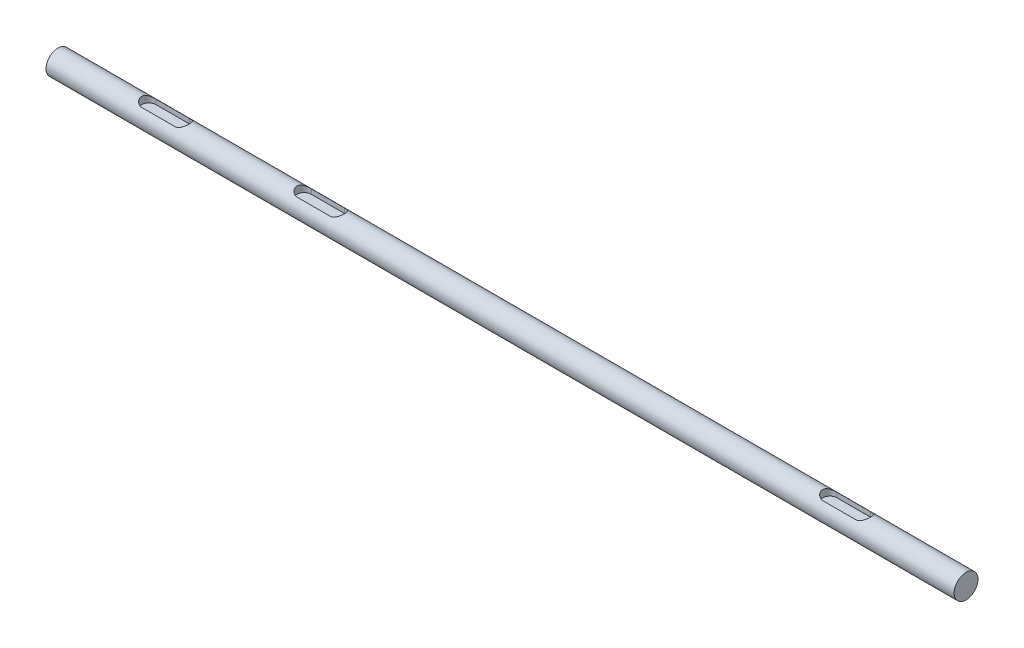
ISO-10303-21;
HEADER;
FILE_DESCRIPTION(('STEP AP214'),'2;1');
FILE_NAME('part.step','',(''),(''),'','','');
FILE_SCHEMA(('AUTOMOTIVE_DESIGN { 1 0 10303 214 1 1 1 1 }'));
ENDSEC;
DATA;
#1=APPLICATION_CONTEXT('core data for automotive mechanical design processes');
#2=APPLICATION_PROTOCOL_DEFINITION('international standard','automotive_design',2000,#1);
#3=PRODUCT_CONTEXT('',#1,'mechanical');
#4=PRODUCT('Part','Part','',(#3));
#5=PRODUCT_RELATED_PRODUCT_CATEGORY('part','',(#4));
#6=PRODUCT_DEFINITION_FORMATION('','',#4);
#7=PRODUCT_DEFINITION_CONTEXT('part definition',#1,'design');
#8=PRODUCT_DEFINITION('design','',#6,#7);
#9=PRODUCT_DEFINITION_SHAPE('','',#8);
#10=(LENGTH_UNIT() NAMED_UNIT(*) SI_UNIT(.MILLI.,.METRE.));
#11=(NAMED_UNIT(*) PLANE_ANGLE_UNIT() SI_UNIT($,.RADIAN.));
#12=(NAMED_UNIT(*) SI_UNIT($,.STERADIAN.) SOLID_ANGLE_UNIT());
#13=UNCERTAINTY_MEASURE_WITH_UNIT(LENGTH_MEASURE(1.E-05),#10,'distance_accuracy_value','');
#14=(GEOMETRIC_REPRESENTATION_CONTEXT(3) GLOBAL_UNCERTAINTY_ASSIGNED_CONTEXT((#13)) GLOBAL_UNIT_ASSIGNED_CONTEXT((#10,
#11,#12)) REPRESENTATION_CONTEXT('',''));
#15=CARTESIAN_POINT('',(0.,0.,0.));
#16=DIRECTION('',(0.,0.,1.));
#17=DIRECTION('',(1.,0.,0.));
#18=AXIS2_PLACEMENT_3D('',#15,#16,#17);
#19=CARTESIAN_POINT('',(150.,0.,0.));
#20=DIRECTION('',(-1.,0.,0.));
#21=DIRECTION('',(0.,0.,1.));
#22=AXIS2_PLACEMENT_3D('',#19,#20,#21);
#23=CYLINDRICAL_SURFACE('',#22,5.);
#24=DIRECTION('',(-1.,0.,0.));
#25=VECTOR('',#24,1.);
#26=CARTESIAN_POINT('',(150.,4.,-3.));
#27=LINE('',#26,#25);
#28=CARTESIAN_POINT('',(-42.,4.,-3.));
#29=VERTEX_POINT('',#28);
#30=CARTESIAN_POINT('',(-28.,4.,-3.));
#31=VERTEX_POINT('',#30);
#32=EDGE_CURVE('E11',#29,#31,#27,.F.);
#33=ORIENTED_EDGE('',*,*,#32,.T.);
#34=CARTESIAN_POINT('',(-28.,4.,-3.));
#35=CARTESIAN_POINT('',(-27.9241280221834,3.99996787232582,-3.00001692537307));
#36=CARTESIAN_POINT('',(-27.8482749220991,4.00215786299425,-2.99712241547426));
#37=CARTESIAN_POINT('',(-27.6973112239566,4.01073748214673,-2.98564518053647));
#38=CARTESIAN_POINT('',(-27.6221999744858,4.01712301686455,-2.97706800024636));
#39=CARTESIAN_POINT('',(-27.4738703308118,4.03378307190143,-2.95445046977405));
#40=CARTESIAN_POINT('',(-27.4006415989821,4.04402606066036,-2.94045438932729));
#41=CARTESIAN_POINT('',(-27.2559715272574,4.06798283405873,-2.90722136348392));
#42=CARTESIAN_POINT('',(-27.1845305495832,4.0816973159079,-2.88798336524856));
#43=CARTESIAN_POINT('',(-26.9740702999556,4.12720949885208,-2.8229314582683));
#44=CARTESIAN_POINT('',(-26.8382388208228,4.16345930010658,-2.76967363516867));
#45=CARTESIAN_POINT('',(-26.5773474913312,4.24363256758645,-2.64519536397733));
#46=CARTESIAN_POINT('',(-26.452312966274,4.28757338079438,-2.57393414481207));
#47=CARTESIAN_POINT('',(-26.2000829262627,4.38458187114305,-2.40540739276781));
#48=CARTESIAN_POINT('',(-26.0744671609752,4.43810998768876,-2.30603538494307));
#49=CARTESIAN_POINT('',(-25.8404290288709,4.54454402644166,-2.08849836637956));
#50=CARTESIAN_POINT('',(-25.7320128445211,4.59744971861748,-1.97032662842432));
#51=CARTESIAN_POINT('',(-25.5237215220427,4.70351635584217,-1.70284992270617));
#52=CARTESIAN_POINT('',(-25.4260392778907,4.75608571502877,-1.55155989155464));
#53=CARTESIAN_POINT('',(-25.3002589397949,4.82570253754456,-1.31133584893003));
#54=CARTESIAN_POINT('',(-25.2617799908048,4.84737427703644,-1.22901675253547));
#55=CARTESIAN_POINT('',(-25.1922108027474,4.88700901757081,-1.06047705712917));
#56=CARTESIAN_POINT('',(-25.1611156760923,4.90497447088308,-0.974259084161877));
#57=CARTESIAN_POINT('',(-25.1093725588663,4.93511192382809,-0.806968111144919));
#58=CARTESIAN_POINT('',(-25.0880127734137,4.94767213737429,-0.726184333286254));
#59=CARTESIAN_POINT('',(-25.0520501099069,4.96892319630847,-0.562666702523369));
#60=CARTESIAN_POINT('',(-25.0374434665847,4.97761619778881,-0.479933963388205));
#61=CARTESIAN_POINT('',(-25.0152153598201,4.99087752212245,-0.313245067395159));
#62=CARTESIAN_POINT('',(-25.0075901838673,4.99544803715671,-0.229289584910363));
#63=CARTESIAN_POINT('',(-24.9994333600349,5.00033941568446,-0.0609399693770666));
#64=CARTESIAN_POINT('',(-24.998900990462,5.00066071153612,0.0234541181691716));
#65=CARTESIAN_POINT('',(-25.0072428016894,4.9956526925416,0.255171482719202));
#66=CARTESIAN_POINT('',(-25.023471259101,4.98590474727508,0.402220564293304));
#67=CARTESIAN_POINT('',(-25.0769555993607,4.95416382666838,0.690956802634009));
#68=CARTESIAN_POINT('',(-25.1142129542032,4.93216999413411,0.832643583305875));
#69=CARTESIAN_POINT('',(-25.208333074643,4.87769664946882,1.10810810538678));
#70=CARTESIAN_POINT('',(-25.26530867548,4.8451568590039,1.24183502003439));
#71=CARTESIAN_POINT('',(-25.3967704462755,4.77219201218866,1.49798262201563));
#72=CARTESIAN_POINT('',(-25.4712606642976,4.73176513330436,1.62040068646819));
#73=CARTESIAN_POINT('',(-25.6456691473636,4.64076401053392,1.86613229963392));
#74=CARTESIAN_POINT('',(-25.7475609391838,4.5895545518581,1.98780984018438));
#75=CARTESIAN_POINT('',(-25.9687674333155,4.48512684863209,2.21339922400098));
#76=CARTESIAN_POINT('',(-26.0881100798147,4.43190548570084,2.31728198187349));
#77=CARTESIAN_POINT('',(-26.3574679760507,4.322164352034,2.5165997199067));
#78=CARTESIAN_POINT('',(-26.5094373284318,4.26598422797724,2.60963495464279));
#79=CARTESIAN_POINT('',(-26.7497711478056,4.1901448347924,2.72853585268935));
#80=CARTESIAN_POINT('',(-26.8318604123314,4.16628916905457,2.76470247721435));
#81=CARTESIAN_POINT('',(-26.9998112007359,4.12235655723053,2.82979053218026));
#82=CARTESIAN_POINT('',(-27.0856695628082,4.10227651585106,2.8587179039267));
#83=CARTESIAN_POINT('',(-27.2391915884192,4.07119612829703,2.90274028553152));
#84=CARTESIAN_POINT('',(-27.3061805456493,4.05917589940332,2.91948814079958));
#85=CARTESIAN_POINT('',(-27.4416068052408,4.03823334849025,2.94838741026761));
#86=CARTESIAN_POINT('',(-27.5100436221323,4.02931000501334,2.96054034014789));
#87=CARTESIAN_POINT('',(-27.6484237803627,4.0148292966003,2.9801517937935));
#88=CARTESIAN_POINT('',(-27.7183742042031,4.00929524901473,2.98757781123641));
#89=CARTESIAN_POINT('',(-27.8588785148202,4.00186666189432,2.99751072442895));
#90=CARTESIAN_POINT('',(-27.9294328988839,3.99997548544344,3.00001307471461));
#91=CARTESIAN_POINT('',(-28.,4.,3.));
#92=B_SPLINE_CURVE_WITH_KNOTS('',3,(#34,#35,#36,#37,#38,#39,#40,#41,#42,#43,#44,#45,#46,#47,#48,
#49,#50,#51,#52,#53,#54,#55,#56,#57,#58,#59,#60,#61,#62,#63,#64,#65,#66,#67,#68,#69,#70,#71,#72,
#73,#74,#75,#76,#77,#78,#79,#80,#81,#82,#83,#84,#85,#86,#87,#88,#89,#90,#91),.UNSPECIFIED.,.F.,
.F.,(4,2,2,2,2,2,2,2,2,2,2,2,2,2,2,2,2,2,2,2,2,2,2,2,2,2,2,2,4),(0.,0.227498555850963,
0.454775460929311,0.680233524310973,0.905736904347181,1.35470516337821,1.80469943008078,
2.30931246709203,2.81410648055544,3.37351129512612,3.65339988736764,3.93310269272289,
4.18623678333959,4.43922956632184,4.69208773794773,4.94492018104929,5.38737462629134,
5.82986004658815,6.27492058766907,6.7200840946005,7.21836387040733,7.71745046525489,
8.27476706024815,8.55288821458631,8.83078035880877,9.04083694509352,9.250824181618,
9.462240299649,9.67385150282051),.UNSPECIFIED.);
#93=CARTESIAN_POINT('',(-28.,4.,3.));
#94=VERTEX_POINT('',#93);
#95=EDGE_CURVE('E504',#31,#94,#92,.T.);
#96=ORIENTED_EDGE('',*,*,#95,.T.);
#97=DIRECTION('',(-1.,0.,0.));
#98=VECTOR('',#97,1.);
#99=CARTESIAN_POINT('',(150.,4.,3.));
#100=LINE('',#99,#98);
#101=CARTESIAN_POINT('',(-42.,4.,3.));
#102=VERTEX_POINT('',#101);
#103=EDGE_CURVE('E52',#94,#102,#100,.T.);
#104=ORIENTED_EDGE('',*,*,#103,.T.);
#105=CARTESIAN_POINT('',(-42.,4.,3.));
#106=CARTESIAN_POINT('',(-42.0758719778166,3.99996787232582,3.00001692537307));
#107=CARTESIAN_POINT('',(-42.1517250779009,4.00215786299425,2.99712241547426));
#108=CARTESIAN_POINT('',(-42.3026887760434,4.01073748214673,2.98564518053647));
#109=CARTESIAN_POINT('',(-42.3778000255142,4.01712301686455,2.97706800024636));
#110=CARTESIAN_POINT('',(-42.5261296691882,4.03378307190143,2.95445046977405));
#111=CARTESIAN_POINT('',(-42.5993584010179,4.04402606066036,2.9404543893273));
#112=CARTESIAN_POINT('',(-42.7440284727426,4.06798283405872,2.90722136348392));
#113=CARTESIAN_POINT('',(-42.8154694504168,4.0816973159079,2.88798336524856));
#114=CARTESIAN_POINT('',(-43.0259297000444,4.12720949885209,2.8229314582683));
#115=CARTESIAN_POINT('',(-43.1617611791772,4.16345930010658,2.76967363516867));
#116=CARTESIAN_POINT('',(-43.4226525086688,4.24363256758645,2.64519536397734));
#117=CARTESIAN_POINT('',(-43.547687033726,4.28757338079438,2.57393414481208));
#118=CARTESIAN_POINT('',(-43.7999170737373,4.38458187114305,2.40540739276781));
#119=CARTESIAN_POINT('',(-43.9255328390247,4.43810998768876,2.30603538494307));
#120=CARTESIAN_POINT('',(-44.1595709711291,4.54454402644166,2.08849836637956));
#121=CARTESIAN_POINT('',(-44.2679871554789,4.59744971861748,1.97032662842432));
#122=CARTESIAN_POINT('',(-44.4762784779573,4.70351635584217,1.70284992270617));
#123=CARTESIAN_POINT('',(-44.5739607221093,4.75608571502877,1.55155989155464));
#124=CARTESIAN_POINT('',(-44.6997410602051,4.82570253754456,1.31133584893003));
#125=CARTESIAN_POINT('',(-44.7382200091952,4.84737427703644,1.22901675253547));
#126=CARTESIAN_POINT('',(-44.8077891972526,4.88700901757081,1.06047705712918));
#127=CARTESIAN_POINT('',(-44.8388843239077,4.90497447088308,0.974259084161879));
#128=CARTESIAN_POINT('',(-44.8906274411337,4.93511192382809,0.806968111144922));
#129=CARTESIAN_POINT('',(-44.9119872265863,4.94767213737429,0.726184333286258));
#130=CARTESIAN_POINT('',(-44.9479498900931,4.96892319630847,0.562666702523372));
#131=CARTESIAN_POINT('',(-44.9625565334154,4.97761619778881,0.479933963388208));
#132=CARTESIAN_POINT('',(-44.9847846401799,4.99087752212245,0.313245067395162));
#133=CARTESIAN_POINT('',(-44.9924098161327,4.99544803715671,0.229289584910366));
#134=CARTESIAN_POINT('',(-45.0005666399651,5.00033941568446,0.0609399693770691));
#135=CARTESIAN_POINT('',(-45.001099009538,5.00066071153612,-0.0234541181691696));
#136=CARTESIAN_POINT('',(-44.9927571983106,4.99565269254161,-0.2551714827192));
#137=CARTESIAN_POINT('',(-44.976528740899,4.98590474727508,-0.402220564293303));
#138=CARTESIAN_POINT('',(-44.9230444006393,4.95416382666838,-0.690956802634007));
#139=CARTESIAN_POINT('',(-44.8857870457968,4.93216999413411,-0.832643583305873));
#140=CARTESIAN_POINT('',(-44.791666925357,4.87769664946882,-1.10810810538677));
#141=CARTESIAN_POINT('',(-44.73469132452,4.8451568590039,-1.24183502003439));
#142=CARTESIAN_POINT('',(-44.6032295537245,4.77219201218867,-1.49798262201564));
#143=CARTESIAN_POINT('',(-44.5287393357024,4.73176513330436,-1.62040068646819));
#144=CARTESIAN_POINT('',(-44.3543308526364,4.64076401053392,-1.86613229963392));
#145=CARTESIAN_POINT('',(-44.2524390608162,4.5895545518581,-1.98780984018439));
#146=CARTESIAN_POINT('',(-44.0312325666845,4.48512684863209,-2.21339922400099));
#147=CARTESIAN_POINT('',(-43.9118899201853,4.43190548570084,-2.31728198187349));
#148=CARTESIAN_POINT('',(-43.6425320239493,4.322164352034,-2.5165997199067));
#149=CARTESIAN_POINT('',(-43.4905626715682,4.26598422797724,-2.60963495464279));
#150=CARTESIAN_POINT('',(-43.2502288521944,4.1901448347924,-2.72853585268935));
#151=CARTESIAN_POINT('',(-43.1681395876686,4.16628916905457,-2.76470247721435));
#152=CARTESIAN_POINT('',(-43.0001887992641,4.12235655723053,-2.82979053218026));
#153=CARTESIAN_POINT('',(-42.9143304371918,4.10227651585106,-2.8587179039267));
#154=CARTESIAN_POINT('',(-42.7608084115808,4.07119612829703,-2.90274028553152));
#155=CARTESIAN_POINT('',(-42.6938194543507,4.05917589940332,-2.91948814079959));
#156=CARTESIAN_POINT('',(-42.5583931947592,4.03823334849025,-2.94838741026761));
#157=CARTESIAN_POINT('',(-42.4899563778677,4.02931000501334,-2.96054034014789));
#158=CARTESIAN_POINT('',(-42.3515762196373,4.0148292966003,-2.9801517937935));
#159=CARTESIAN_POINT('',(-42.2816257957969,4.00929524901473,-2.98757781123641));
#160=CARTESIAN_POINT('',(-42.1411214851798,4.00186666189432,-2.99751072442895));
#161=CARTESIAN_POINT('',(-42.0705671011161,3.99997548544344,-3.00001307471461));
#162=CARTESIAN_POINT('',(-42.,4.,-3.));
#163=B_SPLINE_CURVE_WITH_KNOTS('',3,(#105,#106,#107,#108,#109,#110,#111,#112,#113,#114,#115,
#116,#117,#118,#119,#120,#121,#122,#123,#124,#125,#126,#127,#128,#129,#130,#131,#132,#133,#134,
#135,#136,#137,#138,#139,#140,#141,#142,#143,#144,#145,#146,#147,#148,#149,#150,#151,#152,#153,
#154,#155,#156,#157,#158,#159,#160,#161,#162),.UNSPECIFIED.,.F.,.F.,(4,2,2,2,2,2,2,2,2,2,2,2,2,
2,2,2,2,2,2,2,2,2,2,2,2,2,2,2,4),(0.,0.22749855585097,0.454775460929308,0.680233524310951,
0.905736904347181,1.35470516337821,1.80469943008078,2.30931246709203,2.81410648055544,
3.37351129512612,3.65339988736764,3.93310269272289,4.18623678333959,4.43922956632184,
4.69208773794772,4.94492018104929,5.38737462629134,5.82986004658815,6.27492058766907,
6.7200840946005,7.21836387040733,7.71745046525489,8.27476706024814,8.55288821458631,
8.83078035880877,9.04083694509353,9.25082418161801,9.46224029964901,9.67385150282051),.UNSPECIFIED.);
#164=EDGE_CURVE('E59',#102,#29,#163,.T.);
#165=ORIENTED_EDGE('',*,*,#164,.T.);
#166=EDGE_LOOP('',(#33,#96,#104,#165));
#167=FACE_BOUND('',#166,.T.);
#168=DIRECTION('',(-1.,0.,0.));
#169=VECTOR('',#168,1.);
#170=CARTESIAN_POINT('',(150.,4.,-3.));
#171=LINE('',#170,#169);
#172=CARTESIAN_POINT('',(243.,4.,-3.));
#173=VERTEX_POINT('',#172);
#174=CARTESIAN_POINT('',(257.,4.,-3.));
#175=VERTEX_POINT('',#174);
#176=EDGE_CURVE('E513',#173,#175,#171,.F.);
#177=ORIENTED_EDGE('',*,*,#176,.T.);
#178=CARTESIAN_POINT('',(257.,4.,-3.));
#179=CARTESIAN_POINT('',(257.075871977817,3.99996787232582,-3.00001692537307));
#180=CARTESIAN_POINT('',(257.151725077901,4.00215786299425,-2.99712241547426));
#181=CARTESIAN_POINT('',(257.302688776043,4.01073748214673,-2.98564518053647));
#182=CARTESIAN_POINT('',(257.377800025514,4.01712301686455,-2.97706800024637));
#183=CARTESIAN_POINT('',(257.526129669188,4.03378307190143,-2.95445046977405));
#184=CARTESIAN_POINT('',(257.599358401018,4.04402606066037,-2.94045438932729));
#185=CARTESIAN_POINT('',(257.744028472743,4.06798283405873,-2.90722136348391));
#186=CARTESIAN_POINT('',(257.815469450417,4.08169731590791,-2.88798336524855));
#187=CARTESIAN_POINT('',(258.025929700044,4.12720949885209,-2.82293145826829));
#188=CARTESIAN_POINT('',(258.161761179177,4.16345930010659,-2.76967363516865));
#189=CARTESIAN_POINT('',(258.422652508669,4.24363256758646,-2.64519536397731));
#190=CARTESIAN_POINT('',(258.547687033726,4.28757338079439,-2.57393414481205));
#191=CARTESIAN_POINT('',(258.799917073737,4.38458187114306,-2.40540739276779));
#192=CARTESIAN_POINT('',(258.925532839025,4.43810998768877,-2.30603538494305));
#193=CARTESIAN_POINT('',(259.159570971129,4.54454402644166,-2.08849836637955));
#194=CARTESIAN_POINT('',(259.267987155479,4.59744971861748,-1.97032662842431));
#195=CARTESIAN_POINT('',(259.476278477957,4.70351635584217,-1.70284992270616));
#196=CARTESIAN_POINT('',(259.573960722109,4.75608571502878,-1.55155989155462));
#197=CARTESIAN_POINT('',(259.699741060205,4.82570253754457,-1.31133584893001));
#198=CARTESIAN_POINT('',(259.738220009195,4.84737427703645,-1.22901675253545));
#199=CARTESIAN_POINT('',(259.807789197253,4.88700901757081,-1.06047705712914));
#200=CARTESIAN_POINT('',(259.838884323908,4.90497447088309,-0.974259084161833));
#201=CARTESIAN_POINT('',(259.890627441134,4.9351119238281,-0.806968111144868));
#202=CARTESIAN_POINT('',(259.911987226586,4.9476721373743,-0.726184333286208));
#203=CARTESIAN_POINT('',(259.947949890093,4.96892319630848,-0.562666702523327));
#204=CARTESIAN_POINT('',(259.962556533415,4.97761619778881,-0.479933963388163));
#205=CARTESIAN_POINT('',(259.98478464018,4.99087752212245,-0.313245067395121));
#206=CARTESIAN_POINT('',(259.992409816133,4.99544803715671,-0.229289584910329));
#207=CARTESIAN_POINT('',(260.000566639965,5.00033941568446,-0.0609399693770419));
#208=CARTESIAN_POINT('',(260.001099009538,5.00066071153612,0.023454118169192));
#209=CARTESIAN_POINT('',(259.992757198311,4.9956526925416,0.255171482719215));
#210=CARTESIAN_POINT('',(259.976528740899,4.98590474727508,0.402220564293316));
#211=CARTESIAN_POINT('',(259.923044400639,4.95416382666838,0.690956802634016));
#212=CARTESIAN_POINT('',(259.885787045797,4.93216999413411,0.832643583305879));
#213=CARTESIAN_POINT('',(259.791666925357,4.87769664946882,1.10810810538678));
#214=CARTESIAN_POINT('',(259.73469132452,4.8451568590039,1.24183502003439));
#215=CARTESIAN_POINT('',(259.603229553725,4.77219201218866,1.49798262201564));
#216=CARTESIAN_POINT('',(259.528739335702,4.73176513330435,1.6204006864682));
#217=CARTESIAN_POINT('',(259.354330852636,4.64076401053392,1.86613229963393));
#218=CARTESIAN_POINT('',(259.252439060816,4.5895545518581,1.98780984018439));
#219=CARTESIAN_POINT('',(259.031232566685,4.48512684863209,2.21339922400099));
#220=CARTESIAN_POINT('',(258.911889920185,4.43190548570084,2.31728198187349));
#221=CARTESIAN_POINT('',(258.642532023949,4.322164352034,2.51659971990669));
#222=CARTESIAN_POINT('',(258.490562671568,4.26598422797725,2.60963495464278));
#223=CARTESIAN_POINT('',(258.250228852194,4.1901448347924,2.72853585268934));
#224=CARTESIAN_POINT('',(258.168139587669,4.16628916905457,2.76470247721435));
#225=CARTESIAN_POINT('',(258.000188799264,4.12235655723053,2.82979053218026));
#226=CARTESIAN_POINT('',(257.914330437192,4.10227651585106,2.8587179039267));
#227=CARTESIAN_POINT('',(257.760808411581,4.07119612829703,2.90274028553153));
#228=CARTESIAN_POINT('',(257.693819454351,4.05917589940331,2.91948814079959));
#229=CARTESIAN_POINT('',(257.558393194759,4.03823334849025,2.94838741026762));
#230=CARTESIAN_POINT('',(257.489956377868,4.02931000501334,2.9605403401479));
#231=CARTESIAN_POINT('',(257.351576219637,4.0148292966003,2.98015179379351));
#232=CARTESIAN_POINT('',(257.281625795797,4.00929524901473,2.98757781123642));
#233=CARTESIAN_POINT('',(257.14112148518,4.00186666189432,2.99751072442896));
#234=CARTESIAN_POINT('',(257.070567101116,3.99997548544344,3.00001307471461));
#235=CARTESIAN_POINT('',(257.,4.,3.));
#236=B_SPLINE_CURVE_WITH_KNOTS('',3,(#178,#179,#180,#181,#182,#183,#184,#185,#186,#187,#188,
#189,#190,#191,#192,#193,#194,#195,#196,#197,#198,#199,#200,#201,#202,#203,#204,#205,#206,#207,
#208,#209,#210,#211,#212,#213,#214,#215,#216,#217,#218,#219,#220,#221,#222,#223,#224,#225,#226,
#227,#228,#229,#230,#231,#232,#233,#234,#235),.UNSPECIFIED.,.F.,.F.,(4,2,2,2,2,2,2,2,2,2,2,2,2,
2,2,2,2,2,2,2,2,2,2,2,2,2,2,2,4),(0.,0.227498555850984,0.454775460929315,0.680233524310995,
0.905736904347196,1.35470516337827,1.80469943008082,2.30931246709206,2.81410648055547,
3.37351129512613,3.65339988736766,3.93310269272295,4.18623678333964,4.43922956632189,
4.69208773794776,4.94492018104931,5.38737462629135,5.82986004658817,6.27492058766907,
6.72008409460052,7.21836387040732,7.7174504652549,8.27476706024816,8.55288821458629,
8.83078035880879,9.04083694509359,9.2508241816181,9.46224029964904,9.67385150282058),.UNSPECIFIED.);
#237=CARTESIAN_POINT('',(257.,4.,3.));
#238=VERTEX_POINT('',#237);
#239=EDGE_CURVE('E295',#175,#238,#236,.T.);
#240=ORIENTED_EDGE('',*,*,#239,.T.);
#241=DIRECTION('',(-1.,0.,0.));
#242=VECTOR('',#241,1.);
#243=CARTESIAN_POINT('',(150.,4.,3.));
#244=LINE('',#243,#242);
#245=CARTESIAN_POINT('',(243.,4.,3.));
#246=VERTEX_POINT('',#245);
#247=EDGE_CURVE('E525',#238,#246,#244,.T.);
#248=ORIENTED_EDGE('',*,*,#247,.T.);
#249=CARTESIAN_POINT('',(243.,4.,3.));
#250=CARTESIAN_POINT('',(242.924128022183,3.99996787232582,3.00001692537307));
#251=CARTESIAN_POINT('',(242.848274922099,4.00215786299426,2.99712241547426));
#252=CARTESIAN_POINT('',(242.697311223957,4.01073748214673,2.98564518053647));
#253=CARTESIAN_POINT('',(242.622199974486,4.01712301686455,2.97706800024636));
#254=CARTESIAN_POINT('',(242.473870330812,4.03378307190143,2.95445046977405));
#255=CARTESIAN_POINT('',(242.400641598982,4.04402606066036,2.9404543893273));
#256=CARTESIAN_POINT('',(242.255971527257,4.06798283405872,2.90722136348392));
#257=CARTESIAN_POINT('',(242.184530549583,4.0816973159079,2.88798336524856));
#258=CARTESIAN_POINT('',(241.974070299956,4.12720949885208,2.8229314582683));
#259=CARTESIAN_POINT('',(241.838238820823,4.16345930010658,2.76967363516867));
#260=CARTESIAN_POINT('',(241.577347491331,4.24363256758645,2.64519536397734));
#261=CARTESIAN_POINT('',(241.452312966274,4.28757338079437,2.57393414481208));
#262=CARTESIAN_POINT('',(241.200082926263,4.38458187114304,2.40540739276782));
#263=CARTESIAN_POINT('',(241.074467160975,4.43810998768876,2.30603538494308));
#264=CARTESIAN_POINT('',(240.840429028871,4.54454402644165,2.08849836637957));
#265=CARTESIAN_POINT('',(240.732012844521,4.59744971861747,1.97032662842434));
#266=CARTESIAN_POINT('',(240.523721522043,4.70351635584216,1.70284992270619));
#267=CARTESIAN_POINT('',(240.426039277891,4.75608571502877,1.55155989155465));
#268=CARTESIAN_POINT('',(240.300258939795,4.82570253754456,1.31133584893005));
#269=CARTESIAN_POINT('',(240.261779990805,4.84737427703644,1.22901675253549));
#270=CARTESIAN_POINT('',(240.192210802747,4.8870090175708,1.06047705712919));
#271=CARTESIAN_POINT('',(240.161115676092,4.90497447088308,0.974259084161883));
#272=CARTESIAN_POINT('',(240.109372558866,4.93511192382809,0.806968111144922));
#273=CARTESIAN_POINT('',(240.088012773414,4.94767213737429,0.72618433328626));
#274=CARTESIAN_POINT('',(240.052050109907,4.96892319630847,0.562666702523376));
#275=CARTESIAN_POINT('',(240.037443466585,4.97761619778881,0.479933963388211));
#276=CARTESIAN_POINT('',(240.01521535982,4.99087752212245,0.313245067395167));
#277=CARTESIAN_POINT('',(240.007590183867,4.99544803715671,0.229289584910374));
#278=CARTESIAN_POINT('',(239.999433360035,5.00033941568446,0.060939969377081));
#279=CARTESIAN_POINT('',(239.998900990462,5.00066071153612,-0.0234541181691576));
#280=CARTESIAN_POINT('',(240.007242801689,4.99565269254161,-0.255171482719188));
#281=CARTESIAN_POINT('',(240.023471259101,4.98590474727508,-0.402220564293291));
#282=CARTESIAN_POINT('',(240.076955599361,4.95416382666838,-0.690956802633995));
#283=CARTESIAN_POINT('',(240.114212954203,4.93216999413411,-0.83264358330586));
#284=CARTESIAN_POINT('',(240.208333074643,4.87769664946882,-1.10810810538676));
#285=CARTESIAN_POINT('',(240.26530867548,4.8451568590039,-1.24183502003437));
#286=CARTESIAN_POINT('',(240.396770446275,4.77219201218867,-1.49798262201562));
#287=CARTESIAN_POINT('',(240.471260664298,4.73176513330436,-1.62040068646818));
#288=CARTESIAN_POINT('',(240.645669147364,4.64076401053392,-1.86613229963392));
#289=CARTESIAN_POINT('',(240.747560939184,4.5895545518581,-1.98780984018438));
#290=CARTESIAN_POINT('',(240.968767433315,4.48512684863209,-2.21339922400099));
#291=CARTESIAN_POINT('',(241.088110079815,4.43190548570084,-2.31728198187349));
#292=CARTESIAN_POINT('',(241.357467976051,4.322164352034,-2.5165997199067));
#293=CARTESIAN_POINT('',(241.509437328432,4.26598422797724,-2.60963495464279));
#294=CARTESIAN_POINT('',(241.749771147806,4.1901448347924,-2.72853585268934));
#295=CARTESIAN_POINT('',(241.831860412331,4.16628916905457,-2.76470247721434));
#296=CARTESIAN_POINT('',(241.999811200736,4.12235655723054,-2.82979053218025));
#297=CARTESIAN_POINT('',(242.085669562808,4.10227651585107,-2.85871790392669));
#298=CARTESIAN_POINT('',(242.239191588419,4.07119612829703,-2.90274028553152));
#299=CARTESIAN_POINT('',(242.306180545649,4.05917589940332,-2.91948814079958));
#300=CARTESIAN_POINT('',(242.441606805241,4.03823334849026,-2.94838741026761));
#301=CARTESIAN_POINT('',(242.510043622132,4.02931000501335,-2.96054034014788));
#302=CARTESIAN_POINT('',(242.648423780363,4.01482929660031,-2.98015179379349));
#303=CARTESIAN_POINT('',(242.718374204203,4.00929524901473,-2.98757781123641));
#304=CARTESIAN_POINT('',(242.85887851482,4.00186666189432,-2.99751072442895));
#305=CARTESIAN_POINT('',(242.929432898884,3.99997548544344,-3.00001307471461));
#306=CARTESIAN_POINT('',(243.,4.,-3.));
#307=B_SPLINE_CURVE_WITH_KNOTS('',3,(#249,#250,#251,#252,#253,#254,#255,#256,#257,#258,#259,
#260,#261,#262,#263,#264,#265,#266,#267,#268,#269,#270,#271,#272,#273,#274,#275,#276,#277,#278,
#279,#280,#281,#282,#283,#284,#285,#286,#287,#288,#289,#290,#291,#292,#293,#294,#295,#296,#297,
#298,#299,#300,#301,#302,#303,#304,#305,#306),.UNSPECIFIED.,.F.,.F.,(4,2,2,2,2,2,2,2,2,2,2,2,2,
2,2,2,2,2,2,2,2,2,2,2,2,2,2,2,4),(0.,0.227498555850984,0.454775460929315,0.680233524310937,
0.905736904347166,1.35470516337824,1.80469943008075,2.30931246709202,2.81410648055543,
3.3735112951261,3.65339988736762,3.93310269272289,4.18623678333959,4.43922956632184,
4.69208773794771,4.94492018104927,5.38737462629133,5.82986004658814,6.27492058766905,
6.7200840946005,7.21836387040733,7.71745046525489,8.27476706024813,8.55288821458631,
8.83078035880876,9.0408369450935,9.25082418161798,9.46224029964897,9.67385150282048),.UNSPECIFIED.);
#308=EDGE_CURVE('E67',#246,#173,#307,.T.);
#309=ORIENTED_EDGE('',*,*,#308,.T.);
#310=EDGE_LOOP('',(#177,#240,#248,#309));
#311=FACE_BOUND('',#310,.T.);
#312=DIRECTION('',(-1.,0.,0.));
#313=VECTOR('',#312,1.);
#314=CARTESIAN_POINT('',(150.,4.,-3.));
#315=LINE('',#314,#313);
#316=CARTESIAN_POINT('',(23.,4.,-3.));
#317=VERTEX_POINT('',#316);
#318=CARTESIAN_POINT('',(37.,4.,-3.));
#319=VERTEX_POINT('',#318);
#320=EDGE_CURVE('E288',#317,#319,#315,.F.);
#321=ORIENTED_EDGE('',*,*,#320,.T.);
#322=CARTESIAN_POINT('',(37.,4.,-3.));
#323=CARTESIAN_POINT('',(37.0758719778166,3.99996787232582,-3.00001692537307));
#324=CARTESIAN_POINT('',(37.1517250779009,4.00215786299425,-2.99712241547426));
#325=CARTESIAN_POINT('',(37.3026887760434,4.01073748214673,-2.98564518053647));
#326=CARTESIAN_POINT('',(37.3778000255142,4.01712301686455,-2.97706800024636));
#327=CARTESIAN_POINT('',(37.5261296691882,4.03378307190143,-2.95445046977405));
#328=CARTESIAN_POINT('',(37.5993584010179,4.04402606066036,-2.9404543893273));
#329=CARTESIAN_POINT('',(37.7440284727426,4.06798283405872,-2.90722136348392));
#330=CARTESIAN_POINT('',(37.8154694504168,4.0816973159079,-2.88798336524856));
#331=CARTESIAN_POINT('',(38.0259297000444,4.12720949885209,-2.8229314582683));
#332=CARTESIAN_POINT('',(38.1617611791772,4.16345930010658,-2.76967363516867));
#333=CARTESIAN_POINT('',(38.4226525086688,4.24363256758645,-2.64519536397734));
#334=CARTESIAN_POINT('',(38.547687033726,4.28757338079438,-2.57393414481208));
#335=CARTESIAN_POINT('',(38.7999170737373,4.38458187114305,-2.40540739276781));
#336=CARTESIAN_POINT('',(38.9255328390247,4.43810998768876,-2.30603538494307));
#337=CARTESIAN_POINT('',(39.1595709711291,4.54454402644166,-2.08849836637956));
#338=CARTESIAN_POINT('',(39.2679871554789,4.59744971861748,-1.97032662842432));
#339=CARTESIAN_POINT('',(39.4762784779573,4.70351635584217,-1.70284992270617));
#340=CARTESIAN_POINT('',(39.5739607221093,4.75608571502877,-1.55155989155464));
#341=CARTESIAN_POINT('',(39.6997410602051,4.82570253754456,-1.31133584893003));
#342=CARTESIAN_POINT('',(39.7382200091952,4.84737427703644,-1.22901675253547));
#343=CARTESIAN_POINT('',(39.8077891972526,4.88700901757081,-1.06047705712918));
#344=CARTESIAN_POINT('',(39.8388843239077,4.90497447088308,-0.974259084161879));
#345=CARTESIAN_POINT('',(39.8906274411337,4.93511192382809,-0.806968111144922));
#346=CARTESIAN_POINT('',(39.9119872265863,4.94767213737429,-0.726184333286258));
#347=CARTESIAN_POINT('',(39.9479498900931,4.96892319630847,-0.562666702523372));
#348=CARTESIAN_POINT('',(39.9625565334154,4.97761619778881,-0.479933963388208));
#349=CARTESIAN_POINT('',(39.9847846401799,4.99087752212245,-0.313245067395162));
#350=CARTESIAN_POINT('',(39.9924098161327,4.99544803715671,-0.229289584910366));
#351=CARTESIAN_POINT('',(40.0005666399651,5.00033941568446,-0.0609399693770696));
#352=CARTESIAN_POINT('',(40.001099009538,5.00066071153612,0.0234541181691694));
#353=CARTESIAN_POINT('',(39.9927571983106,4.9956526925416,0.2551714827192));
#354=CARTESIAN_POINT('',(39.976528740899,4.98590474727508,0.402220564293303));
#355=CARTESIAN_POINT('',(39.9230444006393,4.95416382666838,0.690956802634007));
#356=CARTESIAN_POINT('',(39.8857870457968,4.93216999413411,0.832643583305874));
#357=CARTESIAN_POINT('',(39.791666925357,4.87769664946882,1.10810810538677));
#358=CARTESIAN_POINT('',(39.73469132452,4.8451568590039,1.24183502003439));
#359=CARTESIAN_POINT('',(39.6032295537245,4.77219201218866,1.49798262201563));
#360=CARTESIAN_POINT('',(39.5287393357024,4.73176513330436,1.62040068646819));
#361=CARTESIAN_POINT('',(39.3543308526364,4.64076401053392,1.86613229963392));
#362=CARTESIAN_POINT('',(39.2524390608162,4.5895545518581,1.98780984018439));
#363=CARTESIAN_POINT('',(39.0312325666845,4.48512684863209,2.21339922400099));
#364=CARTESIAN_POINT('',(38.9118899201853,4.43190548570084,2.31728198187349));
#365=CARTESIAN_POINT('',(38.6425320239493,4.322164352034,2.5165997199067));
#366=CARTESIAN_POINT('',(38.4905626715682,4.26598422797724,2.60963495464279));
#367=CARTESIAN_POINT('',(38.2502288521944,4.1901448347924,2.72853585268935));
#368=CARTESIAN_POINT('',(38.1681395876686,4.16628916905457,2.76470247721435));
#369=CARTESIAN_POINT('',(38.0001887992641,4.12235655723053,2.82979053218026));
#370=CARTESIAN_POINT('',(37.9143304371918,4.10227651585106,2.8587179039267));
#371=CARTESIAN_POINT('',(37.7608084115808,4.07119612829703,2.90274028553152));
#372=CARTESIAN_POINT('',(37.6938194543507,4.05917589940332,2.91948814079959));
#373=CARTESIAN_POINT('',(37.5583931947592,4.03823334849025,2.94838741026761));
#374=CARTESIAN_POINT('',(37.4899563778677,4.02931000501334,2.96054034014789));
#375=CARTESIAN_POINT('',(37.3515762196373,4.0148292966003,2.9801517937935));
#376=CARTESIAN_POINT('',(37.2816257957969,4.00929524901473,2.98757781123641));
#377=CARTESIAN_POINT('',(37.1411214851798,4.00186666189432,2.99751072442895));
#378=CARTESIAN_POINT('',(37.0705671011161,3.99997548544344,3.00001307471461));
#379=CARTESIAN_POINT('',(37.,4.,3.));
#380=B_SPLINE_CURVE_WITH_KNOTS('',3,(#322,#323,#324,#325,#326,#327,#328,#329,#330,#331,#332,
#333,#334,#335,#336,#337,#338,#339,#340,#341,#342,#343,#344,#345,#346,#347,#348,#349,#350,#351,
#352,#353,#354,#355,#356,#357,#358,#359,#360,#361,#362,#363,#364,#365,#366,#367,#368,#369,#370,
#371,#372,#373,#374,#375,#376,#377,#378,#379),.UNSPECIFIED.,.F.,.F.,(4,2,2,2,2,2,2,2,2,2,2,2,2,
2,2,2,2,2,2,2,2,2,2,2,2,2,2,2,4),(0.,0.22749855585097,0.454775460929308,0.680233524310951,
0.905736904347181,1.35470516337821,1.80469943008078,2.30931246709203,2.81410648055544,
3.37351129512612,3.65339988736764,3.93310269272289,4.18623678333959,4.43922956632184,
4.69208773794772,4.94492018104929,5.38737462629134,5.82986004658815,6.27492058766907,
6.7200840946005,7.21836387040733,7.71745046525489,8.27476706024814,8.55288821458631,
8.83078035880877,9.04083694509353,9.25082418161801,9.46224029964901,9.67385150282051),.UNSPECIFIED.);
#381=CARTESIAN_POINT('',(37.,4.,3.));
#382=VERTEX_POINT('',#381);
#383=EDGE_CURVE('E232',#319,#382,#380,.T.);
#384=ORIENTED_EDGE('',*,*,#383,.T.);
#385=DIRECTION('',(-1.,0.,0.));
#386=VECTOR('',#385,1.);
#387=CARTESIAN_POINT('',(150.,4.,3.));
#388=LINE('',#387,#386);
#389=CARTESIAN_POINT('',(23.,4.,3.));
#390=VERTEX_POINT('',#389);
#391=EDGE_CURVE('E291',#382,#390,#388,.T.);
#392=ORIENTED_EDGE('',*,*,#391,.T.);
#393=CARTESIAN_POINT('',(23.,4.,3.));
#394=CARTESIAN_POINT('',(22.9241280221834,3.99996787232582,3.00001692537307));
#395=CARTESIAN_POINT('',(22.8482749220991,4.00215786299425,2.99712241547426));
#396=CARTESIAN_POINT('',(22.6973112239566,4.01073748214673,2.98564518053647));
#397=CARTESIAN_POINT('',(22.6221999744858,4.01712301686455,2.97706800024636));
#398=CARTESIAN_POINT('',(22.4738703308118,4.03378307190143,2.95445046977405));
#399=CARTESIAN_POINT('',(22.4006415989821,4.04402606066036,2.94045438932729));
#400=CARTESIAN_POINT('',(22.2559715272574,4.06798283405873,2.90722136348392));
#401=CARTESIAN_POINT('',(22.1845305495832,4.0816973159079,2.88798336524856));
#402=CARTESIAN_POINT('',(21.9740702999556,4.12720949885208,2.8229314582683));
#403=CARTESIAN_POINT('',(21.8382388208228,4.16345930010658,2.76967363516867));
#404=CARTESIAN_POINT('',(21.5773474913312,4.24363256758645,2.64519536397734));
#405=CARTESIAN_POINT('',(21.452312966274,4.28757338079438,2.57393414481207));
#406=CARTESIAN_POINT('',(21.2000829262627,4.38458187114305,2.40540739276781));
#407=CARTESIAN_POINT('',(21.0744671609752,4.43810998768876,2.30603538494307));
#408=CARTESIAN_POINT('',(20.8404290288709,4.54454402644166,2.08849836637956));
#409=CARTESIAN_POINT('',(20.7320128445211,4.59744971861748,1.97032662842432));
#410=CARTESIAN_POINT('',(20.5237215220427,4.70351635584217,1.70284992270617));
#411=CARTESIAN_POINT('',(20.4260392778907,4.75608571502877,1.55155989155464));
#412=CARTESIAN_POINT('',(20.3002589397949,4.82570253754456,1.31133584893003));
#413=CARTESIAN_POINT('',(20.2617799908048,4.84737427703644,1.22901675253547));
#414=CARTESIAN_POINT('',(20.1922108027474,4.88700901757081,1.06047705712918));
#415=CARTESIAN_POINT('',(20.1611156760923,4.90497447088308,0.974259084161878));
#416=CARTESIAN_POINT('',(20.1093725588663,4.93511192382809,0.806968111144919));
#417=CARTESIAN_POINT('',(20.0880127734137,4.94767213737429,0.726184333286254));
#418=CARTESIAN_POINT('',(20.0520501099069,4.96892319630847,0.562666702523369));
#419=CARTESIAN_POINT('',(20.0374434665846,4.97761619778881,0.479933963388205));
#420=CARTESIAN_POINT('',(20.0152153598201,4.99087752212245,0.313245067395159));
#421=CARTESIAN_POINT('',(20.0075901838673,4.99544803715671,0.229289584910363));
#422=CARTESIAN_POINT('',(19.9994333600349,5.00033941568446,0.0609399693770672));
#423=CARTESIAN_POINT('',(19.998900990462,5.00066071153612,-0.0234541181691713));
#424=CARTESIAN_POINT('',(20.0072428016894,4.9956526925416,-0.255171482719202));
#425=CARTESIAN_POINT('',(20.023471259101,4.98590474727508,-0.402220564293304));
#426=CARTESIAN_POINT('',(20.0769555993606,4.95416382666838,-0.690956802634009));
#427=CARTESIAN_POINT('',(20.1142129542032,4.93216999413411,-0.832643583305875));
#428=CARTESIAN_POINT('',(20.208333074643,4.87769664946882,-1.10810810538678));
#429=CARTESIAN_POINT('',(20.26530867548,4.8451568590039,-1.24183502003439));
#430=CARTESIAN_POINT('',(20.3967704462755,4.77219201218866,-1.49798262201563));
#431=CARTESIAN_POINT('',(20.4712606642976,4.73176513330436,-1.62040068646819));
#432=CARTESIAN_POINT('',(20.6456691473636,4.64076401053392,-1.86613229963392));
#433=CARTESIAN_POINT('',(20.7475609391838,4.5895545518581,-1.98780984018438));
#434=CARTESIAN_POINT('',(20.9687674333155,4.48512684863209,-2.21339922400099));
#435=CARTESIAN_POINT('',(21.0881100798147,4.43190548570084,-2.31728198187349));
#436=CARTESIAN_POINT('',(21.3574679760507,4.322164352034,-2.5165997199067));
#437=CARTESIAN_POINT('',(21.5094373284318,4.26598422797724,-2.60963495464279));
#438=CARTESIAN_POINT('',(21.7497711478056,4.1901448347924,-2.72853585268935));
#439=CARTESIAN_POINT('',(21.8318604123314,4.16628916905457,-2.76470247721435));
#440=CARTESIAN_POINT('',(21.9998112007359,4.12235655723053,-2.82979053218026));
#441=CARTESIAN_POINT('',(22.0856695628082,4.10227651585106,-2.8587179039267));
#442=CARTESIAN_POINT('',(22.2391915884192,4.07119612829703,-2.90274028553152));
#443=CARTESIAN_POINT('',(22.3061805456493,4.05917589940332,-2.91948814079958));
#444=CARTESIAN_POINT('',(22.4416068052408,4.03823334849025,-2.94838741026761));
#445=CARTESIAN_POINT('',(22.5100436221323,4.02931000501334,-2.96054034014789));
#446=CARTESIAN_POINT('',(22.6484237803627,4.0148292966003,-2.9801517937935));
#447=CARTESIAN_POINT('',(22.7183742042031,4.00929524901473,-2.98757781123641));
#448=CARTESIAN_POINT('',(22.8588785148202,4.00186666189432,-2.99751072442895));
#449=CARTESIAN_POINT('',(22.9294328988839,3.99997548544344,-3.00001307471461));
#450=CARTESIAN_POINT('',(23.,4.,-3.));
#451=B_SPLINE_CURVE_WITH_KNOTS('',3,(#393,#394,#395,#396,#397,#398,#399,#400,#401,#402,#403,
#404,#405,#406,#407,#408,#409,#410,#411,#412,#413,#414,#415,#416,#417,#418,#419,#420,#421,#422,
#423,#424,#425,#426,#427,#428,#429,#430,#431,#432,#433,#434,#435,#436,#437,#438,#439,#440,#441,
#442,#443,#444,#445,#446,#447,#448,#449,#450),.UNSPECIFIED.,.F.,.F.,(4,2,2,2,2,2,2,2,2,2,2,2,2,
2,2,2,2,2,2,2,2,2,2,2,2,2,2,2,4),(0.,0.227498555850963,0.454775460929311,0.680233524310973,
0.905736904347181,1.35470516337821,1.80469943008078,2.30931246709203,2.81410648055544,
3.37351129512612,3.65339988736764,3.93310269272289,4.18623678333959,4.43922956632184,
4.69208773794773,4.94492018104929,5.38737462629134,5.82986004658815,6.27492058766907,
6.7200840946005,7.21836387040733,7.71745046525489,8.27476706024815,8.55288821458632,
8.83078035880877,9.04083694509352,9.250824181618,9.462240299649,9.67385150282051),.UNSPECIFIED.);
#452=EDGE_CURVE('E252',#390,#317,#451,.T.);
#453=ORIENTED_EDGE('',*,*,#452,.T.);
#454=EDGE_LOOP('',(#321,#384,#392,#453));
#455=FACE_BOUND('',#454,.T.);
#456=CARTESIAN_POINT('',(300.,0.,0.));
#457=DIRECTION('',(1.,0.,0.));
#458=DIRECTION('',(0.,0.,-1.));
#459=AXIS2_PLACEMENT_3D('',#456,#457,#458);
#460=CIRCLE('',#459,5.);
#461=CARTESIAN_POINT('',(300.,0.,-5.));
#462=VERTEX_POINT('',#461);
#463=EDGE_CURVE('E197',#462,#462,#460,.T.);
#464=ORIENTED_EDGE('',*,*,#463,.F.);
#465=EDGE_LOOP('',(#464));
#466=FACE_BOUND('',#465,.T.);
#467=CARTESIAN_POINT('',(-80.,0.,0.));
#468=DIRECTION('',(-1.,0.,0.));
#469=DIRECTION('',(0.,0.,1.));
#470=AXIS2_PLACEMENT_3D('',#467,#468,#469);
#471=CIRCLE('',#470,5.);
#472=CARTESIAN_POINT('',(-80.,0.,5.));
#473=VERTEX_POINT('',#472);
#474=EDGE_CURVE('E167',#473,#473,#471,.T.);
#475=ORIENTED_EDGE('',*,*,#474,.F.);
#476=EDGE_LOOP('',(#475));
#477=FACE_BOUND('',#476,.T.);
#478=ADVANCED_FACE('F43',(#167,#311,#455,#466,#477),#23,.T.);
#479=CARTESIAN_POINT('',(23.,2.,0.));
#480=DIRECTION('',(0.,1.,0.));
#481=DIRECTION('',(0.,0.,1.));
#482=AXIS2_PLACEMENT_3D('',#479,#480,#481);
#483=CYLINDRICAL_SURFACE('',#482,3.);
#484=DIRECTION('',(0.,1.,0.));
#485=VECTOR('',#484,1.);
#486=CARTESIAN_POINT('',(23.,2.,3.));
#487=LINE('',#486,#485);
#488=CARTESIAN_POINT('',(23.,2.,3.));
#489=VERTEX_POINT('',#488);
#490=EDGE_CURVE('E227',#489,#390,#487,.T.);
#491=ORIENTED_EDGE('',*,*,#490,.F.);
#492=CARTESIAN_POINT('',(23.,2.,0.));
#493=DIRECTION('',(0.,1.,0.));
#494=DIRECTION('',(0.,0.,1.));
#495=AXIS2_PLACEMENT_3D('',#492,#493,#494);
#496=CIRCLE('',#495,3.);
#497=CARTESIAN_POINT('',(23.,2.,-3.));
#498=VERTEX_POINT('',#497);
#499=EDGE_CURVE('E211',#498,#489,#496,.T.);
#500=ORIENTED_EDGE('',*,*,#499,.F.);
#501=DIRECTION('',(0.,1.,0.));
#502=VECTOR('',#501,1.);
#503=CARTESIAN_POINT('',(23.,2.,-3.));
#504=LINE('',#503,#502);
#505=EDGE_CURVE('E228',#498,#317,#504,.T.);
#506=ORIENTED_EDGE('',*,*,#505,.T.);
#507=ORIENTED_EDGE('',*,*,#452,.F.);
#508=EDGE_LOOP('',(#491,#500,#506,#507));
#509=FACE_BOUND('',#508,.T.);
#510=ADVANCED_FACE('F270',(#509),#483,.F.);
#511=CARTESIAN_POINT('',(23.,2.,-3.));
#512=DIRECTION('',(0.,0.,-1.));
#513=DIRECTION('',(-1.,0.,0.));
#514=AXIS2_PLACEMENT_3D('',#511,#512,#513);
#515=PLANE('',#514);
#516=ORIENTED_EDGE('',*,*,#505,.F.);
#517=DIRECTION('',(-1.,0.,0.));
#518=VECTOR('',#517,1.);
#519=CARTESIAN_POINT('',(23.,2.,-3.));
#520=LINE('',#519,#518);
#521=CARTESIAN_POINT('',(37.,2.,-3.));
#522=VERTEX_POINT('',#521);
#523=EDGE_CURVE('E223',#522,#498,#520,.T.);
#524=ORIENTED_EDGE('',*,*,#523,.F.);
#525=DIRECTION('',(0.,1.,0.));
#526=VECTOR('',#525,1.);
#527=CARTESIAN_POINT('',(37.,2.,-3.));
#528=LINE('',#527,#526);
#529=EDGE_CURVE('E233',#522,#319,#528,.T.);
#530=ORIENTED_EDGE('',*,*,#529,.T.);
#531=ORIENTED_EDGE('',*,*,#320,.F.);
#532=EDGE_LOOP('',(#516,#524,#530,#531));
#533=FACE_BOUND('',#532,.T.);
#534=ADVANCED_FACE('F264',(#533),#515,.F.);
#535=CARTESIAN_POINT('',(37.,2.,0.));
#536=DIRECTION('',(0.,1.,0.));
#537=DIRECTION('',(0.,0.,1.));
#538=AXIS2_PLACEMENT_3D('',#535,#536,#537);
#539=CYLINDRICAL_SURFACE('',#538,3.);
#540=ORIENTED_EDGE('',*,*,#529,.F.);
#541=CARTESIAN_POINT('',(37.,2.,0.));
#542=DIRECTION('',(0.,1.,0.));
#543=DIRECTION('',(0.,0.,-1.));
#544=AXIS2_PLACEMENT_3D('',#541,#542,#543);
#545=CIRCLE('',#544,3.);
#546=CARTESIAN_POINT('',(37.,2.,3.));
#547=VERTEX_POINT('',#546);
#548=EDGE_CURVE('E219',#547,#522,#545,.T.);
#549=ORIENTED_EDGE('',*,*,#548,.F.);
#550=DIRECTION('',(0.,1.,0.));
#551=VECTOR('',#550,1.);
#552=CARTESIAN_POINT('',(37.,2.,3.));
#553=LINE('',#552,#551);
#554=EDGE_CURVE('E237',#547,#382,#553,.T.);
#555=ORIENTED_EDGE('',*,*,#554,.T.);
#556=ORIENTED_EDGE('',*,*,#383,.F.);
#557=EDGE_LOOP('',(#540,#549,#555,#556));
#558=FACE_BOUND('',#557,.T.);
#559=ADVANCED_FACE('F258',(#558),#539,.F.);
#560=CARTESIAN_POINT('',(23.,2.,3.));
#561=DIRECTION('',(0.,0.,1.));
#562=DIRECTION('',(1.,0.,0.));
#563=AXIS2_PLACEMENT_3D('',#560,#561,#562);
#564=PLANE('',#563);
#565=ORIENTED_EDGE('',*,*,#554,.F.);
#566=DIRECTION('',(1.,0.,0.));
#567=VECTOR('',#566,1.);
#568=CARTESIAN_POINT('',(23.,2.,3.));
#569=LINE('',#568,#567);
#570=EDGE_CURVE('E215',#489,#547,#569,.T.);
#571=ORIENTED_EDGE('',*,*,#570,.F.);
#572=ORIENTED_EDGE('',*,*,#490,.T.);
#573=ORIENTED_EDGE('',*,*,#391,.F.);
#574=EDGE_LOOP('',(#565,#571,#572,#573));
#575=FACE_BOUND('',#574,.T.);
#576=ADVANCED_FACE('F263',(#575),#564,.F.);
#577=CARTESIAN_POINT('',(23.,2.,0.));
#578=DIRECTION('',(0.,1.,0.));
#579=DIRECTION('',(0.,0.,1.));
#580=AXIS2_PLACEMENT_3D('',#577,#578,#579);
#581=PLANE('',#580);
#582=ORIENTED_EDGE('',*,*,#499,.T.);
#583=ORIENTED_EDGE('',*,*,#570,.T.);
#584=ORIENTED_EDGE('',*,*,#548,.T.);
#585=ORIENTED_EDGE('',*,*,#523,.T.);
#586=EDGE_LOOP('',(#582,#583,#584,#585));
#587=FACE_BOUND('',#586,.T.);
#588=ADVANCED_FACE('F268',(#587),#581,.T.);
#589=CARTESIAN_POINT('',(300.,0.,0.));
#590=DIRECTION('',(1.,0.,0.));
#591=DIRECTION('',(0.,0.,-1.));
#592=AXIS2_PLACEMENT_3D('',#589,#590,#591);
#593=PLANE('',#592);
#594=ORIENTED_EDGE('',*,*,#463,.T.);
#595=EDGE_LOOP('',(#594));
#596=FACE_BOUND('',#595,.T.);
#597=ADVANCED_FACE('F328',(#596),#593,.T.);
#598=CARTESIAN_POINT('',(243.,2.,0.));
#599=DIRECTION('',(0.,1.,0.));
#600=DIRECTION('',(0.,0.,1.));
#601=AXIS2_PLACEMENT_3D('',#598,#599,#600);
#602=CYLINDRICAL_SURFACE('',#601,3.);
#603=DIRECTION('',(0.,1.,0.));
#604=VECTOR('',#603,1.);
#605=CARTESIAN_POINT('',(243.,2.,3.));
#606=LINE('',#605,#604);
#607=CARTESIAN_POINT('',(243.,2.,3.));
#608=VERTEX_POINT('',#607);
#609=EDGE_CURVE('E193',#608,#246,#606,.T.);
#610=ORIENTED_EDGE('',*,*,#609,.F.);
#611=CARTESIAN_POINT('',(243.,2.,0.));
#612=DIRECTION('',(0.,1.,0.));
#613=DIRECTION('',(0.,0.,1.));
#614=AXIS2_PLACEMENT_3D('',#611,#612,#613);
#615=CIRCLE('',#614,3.);
#616=CARTESIAN_POINT('',(243.,2.,-3.));
#617=VERTEX_POINT('',#616);
#618=EDGE_CURVE('E177',#617,#608,#615,.T.);
#619=ORIENTED_EDGE('',*,*,#618,.F.);
#620=DIRECTION('',(0.,1.,0.));
#621=VECTOR('',#620,1.);
#622=CARTESIAN_POINT('',(243.,2.,-3.));
#623=LINE('',#622,#621);
#624=EDGE_CURVE('E194',#617,#173,#623,.T.);
#625=ORIENTED_EDGE('',*,*,#624,.T.);
#626=ORIENTED_EDGE('',*,*,#308,.F.);
#627=EDGE_LOOP('',(#610,#619,#625,#626));
#628=FACE_BOUND('',#627,.T.);
#629=ADVANCED_FACE('F324',(#628),#602,.F.);
#630=CARTESIAN_POINT('',(243.,2.,-3.));
#631=DIRECTION('',(0.,0.,-1.));
#632=DIRECTION('',(-1.,0.,0.));
#633=AXIS2_PLACEMENT_3D('',#630,#631,#632);
#634=PLANE('',#633);
#635=ORIENTED_EDGE('',*,*,#624,.F.);
#636=DIRECTION('',(-1.,0.,0.));
#637=VECTOR('',#636,1.);
#638=CARTESIAN_POINT('',(243.,2.,-3.));
#639=LINE('',#638,#637);
#640=CARTESIAN_POINT('',(257.,2.,-3.));
#641=VERTEX_POINT('',#640);
#642=EDGE_CURVE('E189',#641,#617,#639,.T.);
#643=ORIENTED_EDGE('',*,*,#642,.F.);
#644=DIRECTION('',(0.,1.,0.));
#645=VECTOR('',#644,1.);
#646=CARTESIAN_POINT('',(257.,2.,-3.));
#647=LINE('',#646,#645);
#648=EDGE_CURVE('E198',#641,#175,#647,.T.);
#649=ORIENTED_EDGE('',*,*,#648,.T.);
#650=ORIENTED_EDGE('',*,*,#176,.F.);
#651=EDGE_LOOP('',(#635,#643,#649,#650));
#652=FACE_BOUND('',#651,.T.);
#653=ADVANCED_FACE('F318',(#652),#634,.F.);
#654=CARTESIAN_POINT('',(257.,2.,0.));
#655=DIRECTION('',(0.,1.,0.));
#656=DIRECTION('',(0.,0.,1.));
#657=AXIS2_PLACEMENT_3D('',#654,#655,#656);
#658=CYLINDRICAL_SURFACE('',#657,3.);
#659=ORIENTED_EDGE('',*,*,#648,.F.);
#660=CARTESIAN_POINT('',(257.,2.,0.));
#661=DIRECTION('',(0.,1.,0.));
#662=DIRECTION('',(0.,0.,-1.));
#663=AXIS2_PLACEMENT_3D('',#660,#661,#662);
#664=CIRCLE('',#663,3.);
#665=CARTESIAN_POINT('',(257.,2.,3.));
#666=VERTEX_POINT('',#665);
#667=EDGE_CURVE('E185',#666,#641,#664,.T.);
#668=ORIENTED_EDGE('',*,*,#667,.F.);
#669=DIRECTION('',(0.,1.,0.));
#670=VECTOR('',#669,1.);
#671=CARTESIAN_POINT('',(257.,2.,3.));
#672=LINE('',#671,#670);
#673=EDGE_CURVE('E202',#666,#238,#672,.T.);
#674=ORIENTED_EDGE('',*,*,#673,.T.);
#675=ORIENTED_EDGE('',*,*,#239,.F.);
#676=EDGE_LOOP('',(#659,#668,#674,#675));
#677=FACE_BOUND('',#676,.T.);
#678=ADVANCED_FACE('F312',(#677),#658,.F.);
#679=CARTESIAN_POINT('',(243.,2.,3.));
#680=DIRECTION('',(0.,0.,1.));
#681=DIRECTION('',(1.,0.,0.));
#682=AXIS2_PLACEMENT_3D('',#679,#680,#681);
#683=PLANE('',#682);
#684=ORIENTED_EDGE('',*,*,#673,.F.);
#685=DIRECTION('',(1.,0.,0.));
#686=VECTOR('',#685,1.);
#687=CARTESIAN_POINT('',(243.,2.,3.));
#688=LINE('',#687,#686);
#689=EDGE_CURVE('E181',#608,#666,#688,.T.);
#690=ORIENTED_EDGE('',*,*,#689,.F.);
#691=ORIENTED_EDGE('',*,*,#609,.T.);
#692=ORIENTED_EDGE('',*,*,#247,.F.);
#693=EDGE_LOOP('',(#684,#690,#691,#692));
#694=FACE_BOUND('',#693,.T.);
#695=ADVANCED_FACE('F317',(#694),#683,.F.);
#696=CARTESIAN_POINT('',(243.,2.,0.));
#697=DIRECTION('',(0.,1.,0.));
#698=DIRECTION('',(0.,0.,1.));
#699=AXIS2_PLACEMENT_3D('',#696,#697,#698);
#700=PLANE('',#699);
#701=ORIENTED_EDGE('',*,*,#618,.T.);
#702=ORIENTED_EDGE('',*,*,#689,.T.);
#703=ORIENTED_EDGE('',*,*,#667,.T.);
#704=ORIENTED_EDGE('',*,*,#642,.T.);
#705=EDGE_LOOP('',(#701,#702,#703,#704));
#706=FACE_BOUND('',#705,.T.);
#707=ADVANCED_FACE('F322',(#706),#700,.T.);
#708=CARTESIAN_POINT('',(-80.,0.,0.));
#709=DIRECTION('',(-1.,0.,0.));
#710=DIRECTION('',(0.,0.,1.));
#711=AXIS2_PLACEMENT_3D('',#708,#709,#710);
#712=PLANE('',#711);
#713=ORIENTED_EDGE('',*,*,#474,.T.);
#714=EDGE_LOOP('',(#713));
#715=FACE_BOUND('',#714,.T.);
#716=ADVANCED_FACE('F364',(#715),#712,.T.);
#717=CARTESIAN_POINT('',(-42.,2.,0.));
#718=DIRECTION('',(0.,1.,0.));
#719=DIRECTION('',(0.,0.,1.));
#720=AXIS2_PLACEMENT_3D('',#717,#718,#719);
#721=CYLINDRICAL_SURFACE('',#720,3.);
#722=DIRECTION('',(0.,1.,0.));
#723=VECTOR('',#722,1.);
#724=CARTESIAN_POINT('',(-42.,2.,3.));
#725=LINE('',#724,#723);
#726=CARTESIAN_POINT('',(-42.,2.,3.));
#727=VERTEX_POINT('',#726);
#728=EDGE_CURVE('E133',#727,#102,#725,.T.);
#729=ORIENTED_EDGE('',*,*,#728,.F.);
#730=CARTESIAN_POINT('',(-42.,2.,0.));
#731=DIRECTION('',(0.,1.,0.));
#732=DIRECTION('',(0.,0.,1.));
#733=AXIS2_PLACEMENT_3D('',#730,#731,#732);
#734=CIRCLE('',#733,3.);
#735=CARTESIAN_POINT('',(-42.,2.,-3.));
#736=VERTEX_POINT('',#735);
#737=EDGE_CURVE('E137',#736,#727,#734,.T.);
#738=ORIENTED_EDGE('',*,*,#737,.F.);
#739=DIRECTION('',(0.,1.,0.));
#740=VECTOR('',#739,1.);
#741=CARTESIAN_POINT('',(-42.,2.,-3.));
#742=LINE('',#741,#740);
#743=EDGE_CURVE('E164',#736,#29,#742,.T.);
#744=ORIENTED_EDGE('',*,*,#743,.T.);
#745=ORIENTED_EDGE('',*,*,#164,.F.);
#746=EDGE_LOOP('',(#729,#738,#744,#745));
#747=FACE_BOUND('',#746,.T.);
#748=ADVANCED_FACE('F135',(#747),#721,.F.);
#749=CARTESIAN_POINT('',(-42.,2.,-3.));
#750=DIRECTION('',(0.,0.,-1.));
#751=DIRECTION('',(-1.,0.,0.));
#752=AXIS2_PLACEMENT_3D('',#749,#750,#751);
#753=PLANE('',#752);
#754=ORIENTED_EDGE('',*,*,#743,.F.);
#755=DIRECTION('',(-1.,0.,0.));
#756=VECTOR('',#755,1.);
#757=CARTESIAN_POINT('',(-42.,2.,-3.));
#758=LINE('',#757,#756);
#759=CARTESIAN_POINT('',(-28.,2.,-3.));
#760=VERTEX_POINT('',#759);
#761=EDGE_CURVE('E143',#760,#736,#758,.T.);
#762=ORIENTED_EDGE('',*,*,#761,.F.);
#763=DIRECTION('',(0.,1.,0.));
#764=VECTOR('',#763,1.);
#765=CARTESIAN_POINT('',(-28.,2.,-3.));
#766=LINE('',#765,#764);
#767=EDGE_CURVE('E168',#760,#31,#766,.T.);
#768=ORIENTED_EDGE('',*,*,#767,.T.);
#769=ORIENTED_EDGE('',*,*,#32,.F.);
#770=EDGE_LOOP('',(#754,#762,#768,#769));
#771=FACE_BOUND('',#770,.T.);
#772=ADVANCED_FACE('F379',(#771),#753,.F.);
#773=CARTESIAN_POINT('',(-28.,2.,0.));
#774=DIRECTION('',(0.,1.,0.));
#775=DIRECTION('',(0.,0.,1.));
#776=AXIS2_PLACEMENT_3D('',#773,#774,#775);
#777=CYLINDRICAL_SURFACE('',#776,3.);
#778=ORIENTED_EDGE('',*,*,#767,.F.);
#779=CARTESIAN_POINT('',(-28.,2.,0.));
#780=DIRECTION('',(0.,1.,0.));
#781=DIRECTION('',(0.,0.,-1.));
#782=AXIS2_PLACEMENT_3D('',#779,#780,#781);
#783=CIRCLE('',#782,3.);
#784=CARTESIAN_POINT('',(-28.,2.,3.));
#785=VERTEX_POINT('',#784);
#786=EDGE_CURVE('E153',#785,#760,#783,.T.);
#787=ORIENTED_EDGE('',*,*,#786,.F.);
#788=DIRECTION('',(0.,1.,0.));
#789=VECTOR('',#788,1.);
#790=CARTESIAN_POINT('',(-28.,2.,3.));
#791=LINE('',#790,#789);
#792=EDGE_CURVE('E142',#785,#94,#791,.T.);
#793=ORIENTED_EDGE('',*,*,#792,.T.);
#794=ORIENTED_EDGE('',*,*,#95,.F.);
#795=EDGE_LOOP('',(#778,#787,#793,#794));
#796=FACE_BOUND('',#795,.T.);
#797=ADVANCED_FACE('F386',(#796),#777,.F.);
#798=CARTESIAN_POINT('',(-42.,2.,3.));
#799=DIRECTION('',(0.,0.,1.));
#800=DIRECTION('',(1.,0.,0.));
#801=AXIS2_PLACEMENT_3D('',#798,#799,#800);
#802=PLANE('',#801);
#803=ORIENTED_EDGE('',*,*,#792,.F.);
#804=DIRECTION('',(1.,0.,0.));
#805=VECTOR('',#804,1.);
#806=CARTESIAN_POINT('',(-42.,2.,3.));
#807=LINE('',#806,#805);
#808=EDGE_CURVE('E146',#727,#785,#807,.T.);
#809=ORIENTED_EDGE('',*,*,#808,.F.);
#810=ORIENTED_EDGE('',*,*,#728,.T.);
#811=ORIENTED_EDGE('',*,*,#103,.F.);
#812=EDGE_LOOP('',(#803,#809,#810,#811));
#813=FACE_BOUND('',#812,.T.);
#814=ADVANCED_FACE('F147',(#813),#802,.F.);
#815=CARTESIAN_POINT('',(-42.,2.,0.));
#816=DIRECTION('',(0.,1.,0.));
#817=DIRECTION('',(0.,0.,1.));
#818=AXIS2_PLACEMENT_3D('',#815,#816,#817);
#819=PLANE('',#818);
#820=ORIENTED_EDGE('',*,*,#737,.T.);
#821=ORIENTED_EDGE('',*,*,#808,.T.);
#822=ORIENTED_EDGE('',*,*,#786,.T.);
#823=ORIENTED_EDGE('',*,*,#761,.T.);
#824=EDGE_LOOP('',(#820,#821,#822,#823));
#825=FACE_BOUND('',#824,.T.);
#826=ADVANCED_FACE('F155',(#825),#819,.T.);
#827=CLOSED_SHELL('',(#478,#510,#534,#559,#576,#588,#597,#629,#653,#678,#695,#707,#716,#748,
#772,#797,#814,#826));
#828=MANIFOLD_SOLID_BREP('B2',#827);
#829=ADVANCED_BREP_SHAPE_REPRESENTATION('',(#18,#828),#14);
#830=SHAPE_DEFINITION_REPRESENTATION(#9,#829);
ENDSEC;
END-ISO-10303-21;
